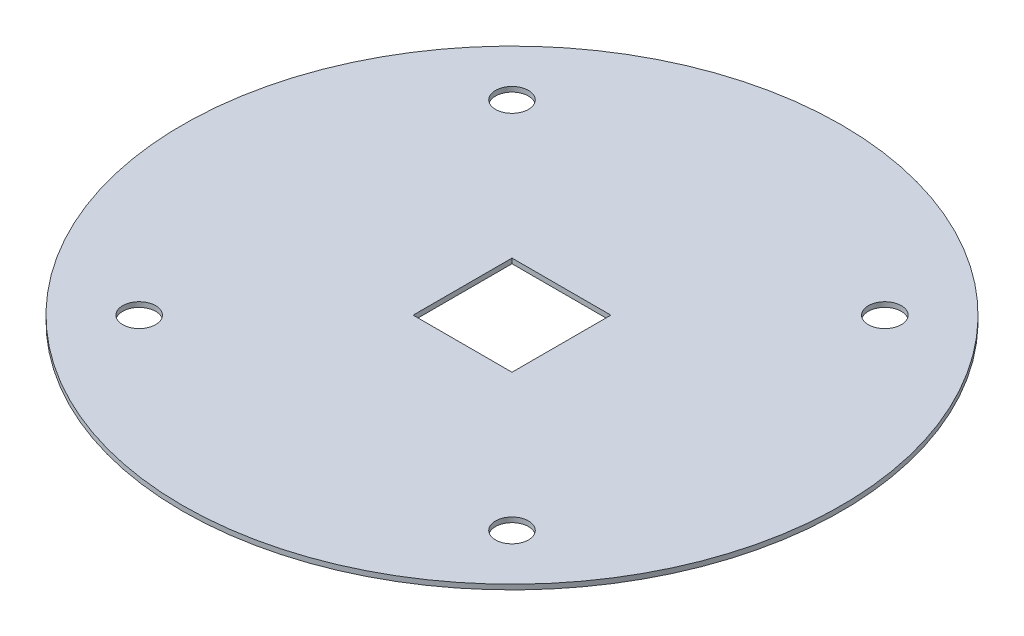
ISO-10303-21;
HEADER;
FILE_DESCRIPTION(('STEP AP214'),'2;1');
FILE_NAME('part.step','',(''),(''),'','','');
FILE_SCHEMA(('AUTOMOTIVE_DESIGN { 1 0 10303 214 1 1 1 1 }'));
ENDSEC;
DATA;
#1=APPLICATION_CONTEXT('core data for automotive mechanical design processes');
#2=APPLICATION_PROTOCOL_DEFINITION('international standard','automotive_design',2000,#1);
#3=PRODUCT_CONTEXT('',#1,'mechanical');
#4=PRODUCT('Part','Part','',(#3));
#5=PRODUCT_RELATED_PRODUCT_CATEGORY('part','',(#4));
#6=PRODUCT_DEFINITION_FORMATION('','',#4);
#7=PRODUCT_DEFINITION_CONTEXT('part definition',#1,'design');
#8=PRODUCT_DEFINITION('design','',#6,#7);
#9=PRODUCT_DEFINITION_SHAPE('','',#8);
#10=(LENGTH_UNIT() NAMED_UNIT(*) SI_UNIT(.MILLI.,.METRE.));
#11=(NAMED_UNIT(*) PLANE_ANGLE_UNIT() SI_UNIT($,.RADIAN.));
#12=(NAMED_UNIT(*) SI_UNIT($,.STERADIAN.) SOLID_ANGLE_UNIT());
#13=UNCERTAINTY_MEASURE_WITH_UNIT(LENGTH_MEASURE(1.E-05),#10,'distance_accuracy_value','');
#14=(GEOMETRIC_REPRESENTATION_CONTEXT(3) GLOBAL_UNCERTAINTY_ASSIGNED_CONTEXT((#13)) GLOBAL_UNIT_ASSIGNED_CONTEXT((#10,
#11,#12)) REPRESENTATION_CONTEXT('',''));
#15=CARTESIAN_POINT('',(0.,0.,0.));
#16=DIRECTION('',(0.,0.,1.));
#17=DIRECTION('',(1.,0.,0.));
#18=AXIS2_PLACEMENT_3D('',#15,#16,#17);
#19=CARTESIAN_POINT('',(0.,3.,0.));
#20=DIRECTION('',(0.,1.,0.));
#21=DIRECTION('',(0.,0.,1.));
#22=AXIS2_PLACEMENT_3D('',#19,#20,#21);
#23=PLANE('',#22);
#24=DIRECTION('',(1.,0.,0.));
#25=VECTOR('',#24,1.);
#26=CARTESIAN_POINT('',(-30.,3.,30.));
#27=LINE('',#26,#25);
#28=CARTESIAN_POINT('',(-30.,3.,30.));
#29=VERTEX_POINT('',#28);
#30=CARTESIAN_POINT('',(30.,3.,30.));
#31=VERTEX_POINT('',#30);
#32=EDGE_CURVE('E51',#29,#31,#27,.T.);
#33=ORIENTED_EDGE('',*,*,#32,.F.);
#34=DIRECTION('',(0.,0.,1.));
#35=VECTOR('',#34,1.);
#36=CARTESIAN_POINT('',(-30.,3.,-30.));
#37=LINE('',#36,#35);
#38=CARTESIAN_POINT('',(-30.,3.,-30.));
#39=VERTEX_POINT('',#38);
#40=EDGE_CURVE('E94',#39,#29,#37,.T.);
#41=ORIENTED_EDGE('',*,*,#40,.F.);
#42=DIRECTION('',(1.,0.,0.));
#43=VECTOR('',#42,1.);
#44=CARTESIAN_POINT('',(-30.,3.,-30.));
#45=LINE('',#44,#43);
#46=CARTESIAN_POINT('',(30.,3.,-30.));
#47=VERTEX_POINT('',#46);
#48=EDGE_CURVE('E97',#39,#47,#45,.T.);
#49=ORIENTED_EDGE('',*,*,#48,.T.);
#50=DIRECTION('',(0.,0.,1.));
#51=VECTOR('',#50,1.);
#52=CARTESIAN_POINT('',(30.,3.,-30.));
#53=LINE('',#52,#51);
#54=EDGE_CURVE('E103',#47,#31,#53,.T.);
#55=ORIENTED_EDGE('',*,*,#54,.T.);
#56=EDGE_LOOP('',(#33,#41,#49,#55));
#57=FACE_BOUND('',#56,.T.);
#58=CARTESIAN_POINT('',(113.137084989848,3.,-113.137084989848));
#59=DIRECTION('',(0.,-1.,0.));
#60=DIRECTION('',(0.,0.,-1.));
#61=AXIS2_PLACEMENT_3D('',#58,#59,#60);
#62=CIRCLE('',#61,9.99999999999999);
#63=CARTESIAN_POINT('',(113.137084989848,3.,-123.137084989848));
#64=VERTEX_POINT('',#63);
#65=EDGE_CURVE('E120',#64,#64,#62,.T.);
#66=ORIENTED_EDGE('',*,*,#65,.T.);
#67=EDGE_LOOP('',(#66));
#68=FACE_BOUND('',#67,.T.);
#69=CARTESIAN_POINT('',(113.137084989848,3.,113.137084989848));
#70=DIRECTION('',(0.,1.,0.));
#71=DIRECTION('',(0.,0.,1.));
#72=AXIS2_PLACEMENT_3D('',#69,#70,#71);
#73=CIRCLE('',#72,9.99999999999999);
#74=CARTESIAN_POINT('',(113.137084989848,3.,123.137084989848));
#75=VERTEX_POINT('',#74);
#76=EDGE_CURVE('E113',#75,#75,#73,.T.);
#77=ORIENTED_EDGE('',*,*,#76,.F.);
#78=EDGE_LOOP('',(#77));
#79=FACE_BOUND('',#78,.T.);
#80=CARTESIAN_POINT('',(-113.137084989848,3.,-113.137084989848));
#81=DIRECTION('',(0.,1.,0.));
#82=DIRECTION('',(0.,0.,1.));
#83=AXIS2_PLACEMENT_3D('',#80,#81,#82);
#84=CIRCLE('',#83,9.99999999999999);
#85=CARTESIAN_POINT('',(-113.137084989848,3.,-103.137084989848));
#86=VERTEX_POINT('',#85);
#87=EDGE_CURVE('E116',#86,#86,#84,.T.);
#88=ORIENTED_EDGE('',*,*,#87,.F.);
#89=EDGE_LOOP('',(#88));
#90=FACE_BOUND('',#89,.T.);
#91=CARTESIAN_POINT('',(0.,3.,0.));
#92=DIRECTION('',(0.,1.,0.));
#93=DIRECTION('',(0.,0.,1.));
#94=AXIS2_PLACEMENT_3D('',#91,#92,#93);
#95=CIRCLE('',#94,200.);
#96=CARTESIAN_POINT('',(0.,3.,200.));
#97=VERTEX_POINT('',#96);
#98=EDGE_CURVE('E11',#97,#97,#95,.T.);
#99=ORIENTED_EDGE('',*,*,#98,.T.);
#100=EDGE_LOOP('',(#99));
#101=FACE_BOUND('',#100,.T.);
#102=CARTESIAN_POINT('',(-113.137084989848,3.,113.137084989848));
#103=DIRECTION('',(0.,-1.,0.));
#104=DIRECTION('',(0.,0.,-1.));
#105=AXIS2_PLACEMENT_3D('',#102,#103,#104);
#106=CIRCLE('',#105,9.99999999999999);
#107=CARTESIAN_POINT('',(-113.137084989848,3.,103.137084989848));
#108=VERTEX_POINT('',#107);
#109=EDGE_CURVE('E126',#108,#108,#106,.T.);
#110=ORIENTED_EDGE('',*,*,#109,.T.);
#111=EDGE_LOOP('',(#110));
#112=FACE_BOUND('',#111,.T.);
#113=ADVANCED_FACE('F36',(#57,#68,#79,#90,#101,#112),#23,.T.);
#114=CARTESIAN_POINT('',(0.,0.,0.));
#115=DIRECTION('',(0.,1.,0.));
#116=DIRECTION('',(0.,0.,1.));
#117=AXIS2_PLACEMENT_3D('',#114,#115,#116);
#118=PLANE('',#117);
#119=DIRECTION('',(0.,0.,1.));
#120=VECTOR('',#119,1.);
#121=CARTESIAN_POINT('',(-30.,0.,-30.));
#122=LINE('',#121,#120);
#123=CARTESIAN_POINT('',(-30.,0.,-30.));
#124=VERTEX_POINT('',#123);
#125=CARTESIAN_POINT('',(-30.,0.,30.));
#126=VERTEX_POINT('',#125);
#127=EDGE_CURVE('E89',#124,#126,#122,.T.);
#128=ORIENTED_EDGE('',*,*,#127,.T.);
#129=DIRECTION('',(1.,0.,0.));
#130=VECTOR('',#129,1.);
#131=CARTESIAN_POINT('',(-30.,0.,30.));
#132=LINE('',#131,#130);
#133=CARTESIAN_POINT('',(30.,0.,30.));
#134=VERTEX_POINT('',#133);
#135=EDGE_CURVE('E84',#126,#134,#132,.T.);
#136=ORIENTED_EDGE('',*,*,#135,.T.);
#137=DIRECTION('',(0.,0.,1.));
#138=VECTOR('',#137,1.);
#139=CARTESIAN_POINT('',(30.,0.,-30.));
#140=LINE('',#139,#138);
#141=CARTESIAN_POINT('',(30.,0.,-30.));
#142=VERTEX_POINT('',#141);
#143=EDGE_CURVE('E76',#142,#134,#140,.T.);
#144=ORIENTED_EDGE('',*,*,#143,.F.);
#145=DIRECTION('',(1.,0.,0.));
#146=VECTOR('',#145,1.);
#147=CARTESIAN_POINT('',(-30.,0.,-30.));
#148=LINE('',#147,#146);
#149=EDGE_CURVE('E83',#124,#142,#148,.T.);
#150=ORIENTED_EDGE('',*,*,#149,.F.);
#151=EDGE_LOOP('',(#128,#136,#144,#150));
#152=FACE_BOUND('',#151,.T.);
#153=CARTESIAN_POINT('',(113.137084989848,0.,113.137084989848));
#154=DIRECTION('',(0.,1.,0.));
#155=DIRECTION('',(0.,0.,1.));
#156=AXIS2_PLACEMENT_3D('',#153,#154,#155);
#157=CIRCLE('',#156,9.99999999999999);
#158=CARTESIAN_POINT('',(113.137084989848,0.,123.137084989848));
#159=VERTEX_POINT('',#158);
#160=EDGE_CURVE('E117',#159,#159,#157,.T.);
#161=ORIENTED_EDGE('',*,*,#160,.T.);
#162=EDGE_LOOP('',(#161));
#163=FACE_BOUND('',#162,.T.);
#164=CARTESIAN_POINT('',(-113.137084989848,0.,-113.137084989848));
#165=DIRECTION('',(0.,1.,0.));
#166=DIRECTION('',(0.,0.,1.));
#167=AXIS2_PLACEMENT_3D('',#164,#165,#166);
#168=CIRCLE('',#167,9.99999999999999);
#169=CARTESIAN_POINT('',(-113.137084989848,0.,-103.137084989848));
#170=VERTEX_POINT('',#169);
#171=EDGE_CURVE('E131',#170,#170,#168,.T.);
#172=ORIENTED_EDGE('',*,*,#171,.T.);
#173=EDGE_LOOP('',(#172));
#174=FACE_BOUND('',#173,.T.);
#175=CARTESIAN_POINT('',(0.,0.,0.));
#176=DIRECTION('',(0.,1.,0.));
#177=DIRECTION('',(0.,0.,1.));
#178=AXIS2_PLACEMENT_3D('',#175,#176,#177);
#179=CIRCLE('',#178,200.);
#180=CARTESIAN_POINT('',(0.,0.,200.));
#181=VERTEX_POINT('',#180);
#182=EDGE_CURVE('E40',#181,#181,#179,.T.);
#183=ORIENTED_EDGE('',*,*,#182,.F.);
#184=EDGE_LOOP('',(#183));
#185=FACE_BOUND('',#184,.T.);
#186=CARTESIAN_POINT('',(113.137084989848,0.,-113.137084989848));
#187=DIRECTION('',(0.,-1.,0.));
#188=DIRECTION('',(0.,0.,-1.));
#189=AXIS2_PLACEMENT_3D('',#186,#187,#188);
#190=CIRCLE('',#189,9.99999999999999);
#191=CARTESIAN_POINT('',(113.137084989848,0.,-123.137084989848));
#192=VERTEX_POINT('',#191);
#193=EDGE_CURVE('E123',#192,#192,#190,.T.);
#194=ORIENTED_EDGE('',*,*,#193,.F.);
#195=EDGE_LOOP('',(#194));
#196=FACE_BOUND('',#195,.T.);
#197=CARTESIAN_POINT('',(-113.137084989848,0.,113.137084989848));
#198=DIRECTION('',(0.,-1.,0.));
#199=DIRECTION('',(0.,0.,-1.));
#200=AXIS2_PLACEMENT_3D('',#197,#198,#199);
#201=CIRCLE('',#200,9.99999999999999);
#202=CARTESIAN_POINT('',(-113.137084989848,0.,103.137084989848));
#203=VERTEX_POINT('',#202);
#204=EDGE_CURVE('E109',#203,#203,#201,.T.);
#205=ORIENTED_EDGE('',*,*,#204,.F.);
#206=EDGE_LOOP('',(#205));
#207=FACE_BOUND('',#206,.T.);
#208=ADVANCED_FACE('F91',(#152,#163,#174,#185,#196,#207),#118,.F.);
#209=CARTESIAN_POINT('',(0.,3.,0.));
#210=DIRECTION('',(0.,-1.,0.));
#211=DIRECTION('',(0.,0.,-1.));
#212=AXIS2_PLACEMENT_3D('',#209,#210,#211);
#213=CYLINDRICAL_SURFACE('',#212,200.);
#214=ORIENTED_EDGE('',*,*,#98,.F.);
#215=EDGE_LOOP('',(#214));
#216=FACE_BOUND('',#215,.T.);
#217=ORIENTED_EDGE('',*,*,#182,.T.);
#218=EDGE_LOOP('',(#217));
#219=FACE_BOUND('',#218,.T.);
#220=ADVANCED_FACE('F38',(#216,#219),#213,.T.);
#221=CARTESIAN_POINT('',(-113.137084989848,0.,-113.137084989848));
#222=DIRECTION('',(0.,1.,0.));
#223=DIRECTION('',(0.,0.,1.));
#224=AXIS2_PLACEMENT_3D('',#221,#222,#223);
#225=CYLINDRICAL_SURFACE('',#224,9.99999999999999);
#226=ORIENTED_EDGE('',*,*,#171,.F.);
#227=EDGE_LOOP('',(#226));
#228=FACE_BOUND('',#227,.T.);
#229=ORIENTED_EDGE('',*,*,#87,.T.);
#230=EDGE_LOOP('',(#229));
#231=FACE_BOUND('',#230,.T.);
#232=ADVANCED_FACE('F137',(#228,#231),#225,.F.);
#233=CARTESIAN_POINT('',(113.137084989848,0.,113.137084989848));
#234=DIRECTION('',(0.,1.,0.));
#235=DIRECTION('',(0.,0.,1.));
#236=AXIS2_PLACEMENT_3D('',#233,#234,#235);
#237=CYLINDRICAL_SURFACE('',#236,9.99999999999999);
#238=ORIENTED_EDGE('',*,*,#160,.F.);
#239=EDGE_LOOP('',(#238));
#240=FACE_BOUND('',#239,.T.);
#241=ORIENTED_EDGE('',*,*,#76,.T.);
#242=EDGE_LOOP('',(#241));
#243=FACE_BOUND('',#242,.T.);
#244=ADVANCED_FACE('F158',(#240,#243),#237,.F.);
#245=CARTESIAN_POINT('',(113.137084989848,0.,-113.137084989848));
#246=DIRECTION('',(0.,1.,0.));
#247=DIRECTION('',(0.,0.,1.));
#248=AXIS2_PLACEMENT_3D('',#245,#246,#247);
#249=CYLINDRICAL_SURFACE('',#248,9.99999999999999);
#250=ORIENTED_EDGE('',*,*,#193,.T.);
#251=EDGE_LOOP('',(#250));
#252=FACE_BOUND('',#251,.T.);
#253=ORIENTED_EDGE('',*,*,#65,.F.);
#254=EDGE_LOOP('',(#253));
#255=FACE_BOUND('',#254,.T.);
#256=ADVANCED_FACE('F149',(#252,#255),#249,.F.);
#257=CARTESIAN_POINT('',(-113.137084989848,0.,113.137084989848));
#258=DIRECTION('',(0.,1.,0.));
#259=DIRECTION('',(0.,0.,1.));
#260=AXIS2_PLACEMENT_3D('',#257,#258,#259);
#261=CYLINDRICAL_SURFACE('',#260,9.99999999999999);
#262=ORIENTED_EDGE('',*,*,#204,.T.);
#263=EDGE_LOOP('',(#262));
#264=FACE_BOUND('',#263,.T.);
#265=ORIENTED_EDGE('',*,*,#109,.F.);
#266=EDGE_LOOP('',(#265));
#267=FACE_BOUND('',#266,.T.);
#268=ADVANCED_FACE('F147',(#264,#267),#261,.F.);
#269=CARTESIAN_POINT('',(-30.,0.,30.));
#270=DIRECTION('',(0.,0.,1.));
#271=DIRECTION('',(1.,0.,0.));
#272=AXIS2_PLACEMENT_3D('',#269,#270,#271);
#273=PLANE('',#272);
#274=ORIENTED_EDGE('',*,*,#32,.T.);
#275=DIRECTION('',(0.,1.,0.));
#276=VECTOR('',#275,1.);
#277=CARTESIAN_POINT('',(30.,0.,30.));
#278=LINE('',#277,#276);
#279=EDGE_CURVE('E78',#134,#31,#278,.T.);
#280=ORIENTED_EDGE('',*,*,#279,.F.);
#281=ORIENTED_EDGE('',*,*,#135,.F.);
#282=DIRECTION('',(0.,1.,0.));
#283=VECTOR('',#282,1.);
#284=CARTESIAN_POINT('',(-30.,0.,30.));
#285=LINE('',#284,#283);
#286=EDGE_CURVE('E107',#126,#29,#285,.T.);
#287=ORIENTED_EDGE('',*,*,#286,.T.);
#288=EDGE_LOOP('',(#274,#280,#281,#287));
#289=FACE_BOUND('',#288,.T.);
#290=ADVANCED_FACE('F87',(#289),#273,.F.);
#291=CARTESIAN_POINT('',(-30.,0.,-30.));
#292=DIRECTION('',(-1.,0.,0.));
#293=DIRECTION('',(0.,0.,1.));
#294=AXIS2_PLACEMENT_3D('',#291,#292,#293);
#295=PLANE('',#294);
#296=ORIENTED_EDGE('',*,*,#40,.T.);
#297=ORIENTED_EDGE('',*,*,#286,.F.);
#298=ORIENTED_EDGE('',*,*,#127,.F.);
#299=DIRECTION('',(0.,1.,0.));
#300=VECTOR('',#299,1.);
#301=CARTESIAN_POINT('',(-30.,0.,-30.));
#302=LINE('',#301,#300);
#303=EDGE_CURVE('E110',#124,#39,#302,.T.);
#304=ORIENTED_EDGE('',*,*,#303,.T.);
#305=EDGE_LOOP('',(#296,#297,#298,#304));
#306=FACE_BOUND('',#305,.T.);
#307=ADVANCED_FACE('F156',(#306),#295,.F.);
#308=CARTESIAN_POINT('',(-30.,0.,-30.));
#309=DIRECTION('',(0.,0.,1.));
#310=DIRECTION('',(1.,0.,0.));
#311=AXIS2_PLACEMENT_3D('',#308,#309,#310);
#312=PLANE('',#311);
#313=ORIENTED_EDGE('',*,*,#48,.F.);
#314=ORIENTED_EDGE('',*,*,#303,.F.);
#315=ORIENTED_EDGE('',*,*,#149,.T.);
#316=DIRECTION('',(0.,1.,0.));
#317=VECTOR('',#316,1.);
#318=CARTESIAN_POINT('',(30.,0.,-30.));
#319=LINE('',#318,#317);
#320=EDGE_CURVE('E59',#142,#47,#319,.T.);
#321=ORIENTED_EDGE('',*,*,#320,.T.);
#322=EDGE_LOOP('',(#313,#314,#315,#321));
#323=FACE_BOUND('',#322,.T.);
#324=ADVANCED_FACE('F194',(#323),#312,.T.);
#325=CARTESIAN_POINT('',(30.,0.,-30.));
#326=DIRECTION('',(-1.,0.,0.));
#327=DIRECTION('',(0.,0.,1.));
#328=AXIS2_PLACEMENT_3D('',#325,#326,#327);
#329=PLANE('',#328);
#330=ORIENTED_EDGE('',*,*,#54,.F.);
#331=ORIENTED_EDGE('',*,*,#320,.F.);
#332=ORIENTED_EDGE('',*,*,#143,.T.);
#333=ORIENTED_EDGE('',*,*,#279,.T.);
#334=EDGE_LOOP('',(#330,#331,#332,#333));
#335=FACE_BOUND('',#334,.T.);
#336=ADVANCED_FACE('F77',(#335),#329,.T.);
#337=CLOSED_SHELL('',(#113,#208,#220,#232,#244,#256,#268,#290,#307,#324,#336));
#338=MANIFOLD_SOLID_BREP('B2',#337);
#339=ADVANCED_BREP_SHAPE_REPRESENTATION('',(#18,#338),#14);
#340=SHAPE_DEFINITION_REPRESENTATION(#9,#339);
ENDSEC;
END-ISO-10303-21;
